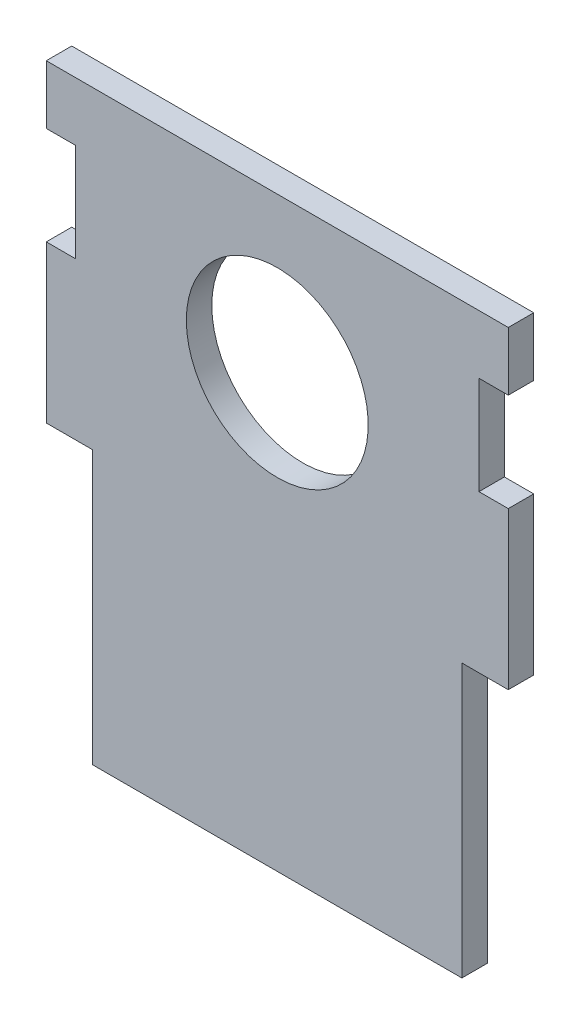
ISO-10303-21;
HEADER;
FILE_DESCRIPTION(('STEP AP214'),'2;1');
FILE_NAME('part.step','',(''),(''),'','','');
FILE_SCHEMA(('AUTOMOTIVE_DESIGN { 1 0 10303 214 1 1 1 1 }'));
ENDSEC;
DATA;
#1=APPLICATION_CONTEXT('core data for automotive mechanical design processes');
#2=APPLICATION_PROTOCOL_DEFINITION('international standard','automotive_design',2000,#1);
#3=PRODUCT_CONTEXT('',#1,'mechanical');
#4=PRODUCT('Part','Part','',(#3));
#5=PRODUCT_RELATED_PRODUCT_CATEGORY('part','',(#4));
#6=PRODUCT_DEFINITION_FORMATION('','',#4);
#7=PRODUCT_DEFINITION_CONTEXT('part definition',#1,'design');
#8=PRODUCT_DEFINITION('design','',#6,#7);
#9=PRODUCT_DEFINITION_SHAPE('','',#8);
#10=(LENGTH_UNIT() NAMED_UNIT(*) SI_UNIT(.MILLI.,.METRE.));
#11=(NAMED_UNIT(*) PLANE_ANGLE_UNIT() SI_UNIT($,.RADIAN.));
#12=(NAMED_UNIT(*) SI_UNIT($,.STERADIAN.) SOLID_ANGLE_UNIT());
#13=UNCERTAINTY_MEASURE_WITH_UNIT(LENGTH_MEASURE(1.E-05),#10,'distance_accuracy_value','');
#14=(GEOMETRIC_REPRESENTATION_CONTEXT(3) GLOBAL_UNCERTAINTY_ASSIGNED_CONTEXT((#13)) GLOBAL_UNIT_ASSIGNED_CONTEXT((#10,
#11,#12)) REPRESENTATION_CONTEXT('',''));
#15=CARTESIAN_POINT('',(0.,0.,0.));
#16=DIRECTION('',(0.,0.,1.));
#17=DIRECTION('',(1.,0.,0.));
#18=AXIS2_PLACEMENT_3D('',#15,#16,#17);
#19=CARTESIAN_POINT('',(0.,0.45,0.));
#20=DIRECTION('',(0.,0.,1.));
#21=DIRECTION('',(1.,0.,0.));
#22=AXIS2_PLACEMENT_3D('',#19,#20,#21);
#23=PLANE('',#22);
#24=CARTESIAN_POINT('',(0.,3.5,0.));
#25=DIRECTION('',(0.,0.,-1.));
#26=DIRECTION('',(1.,0.,0.));
#27=AXIS2_PLACEMENT_3D('',#24,#25,#26);
#28=CIRCLE('',#27,2.);
#29=CARTESIAN_POINT('',(-2.,3.5,0.));
#30=VERTEX_POINT('',#29);
#31=EDGE_CURVE('E291',#30,#30,#28,.T.);
#32=ORIENTED_EDGE('',*,*,#31,.T.);
#33=EDGE_LOOP('',(#32));
#34=FACE_BOUND('',#33,.T.);
#35=DIRECTION('',(1.,0.,0.));
#36=VECTOR('',#35,1.);
#37=CARTESIAN_POINT('',(3.2578341766688,5.60965004635288,0.));
#38=LINE('',#37,#36);
#39=CARTESIAN_POINT('',(4.43518107104955,5.60965004635288,0.));
#40=VERTEX_POINT('',#39);
#41=CARTESIAN_POINT('',(5.08,5.60965004635288,0.));
#42=VERTEX_POINT('',#41);
#43=EDGE_CURVE('E265',#40,#42,#38,.T.);
#44=ORIENTED_EDGE('',*,*,#43,.T.);
#45=DIRECTION('',(0.,1.,0.));
#46=VECTOR('',#45,1.);
#47=CARTESIAN_POINT('',(5.08,0.,0.));
#48=LINE('',#47,#46);
#49=CARTESIAN_POINT('',(5.08,6.9,0.));
#50=VERTEX_POINT('',#49);
#51=EDGE_CURVE('E274',#42,#50,#48,.T.);
#52=ORIENTED_EDGE('',*,*,#51,.T.);
#53=DIRECTION('',(-1.,0.,0.));
#54=VECTOR('',#53,1.);
#55=CARTESIAN_POINT('',(4.06,6.9,0.));
#56=LINE('',#55,#54);
#57=CARTESIAN_POINT('',(-5.08,6.9,0.));
#58=VERTEX_POINT('',#57);
#59=EDGE_CURVE('E11',#50,#58,#56,.T.);
#60=ORIENTED_EDGE('',*,*,#59,.T.);
#61=DIRECTION('',(0.,-1.,0.));
#62=VECTOR('',#61,1.);
#63=CARTESIAN_POINT('',(-5.08,6.9,0.));
#64=LINE('',#63,#62);
#65=CARTESIAN_POINT('',(-5.08,5.60965004635288,0.));
#66=VERTEX_POINT('',#65);
#67=EDGE_CURVE('E194',#58,#66,#64,.T.);
#68=ORIENTED_EDGE('',*,*,#67,.T.);
#69=DIRECTION('',(1.,0.,0.));
#70=VECTOR('',#69,1.);
#71=CARTESIAN_POINT('',(-2.21759053552478,5.60965004635288,0.));
#72=LINE('',#71,#70);
#73=CARTESIAN_POINT('',(-4.43518107104955,5.60965004635288,0.));
#74=VERTEX_POINT('',#73);
#75=EDGE_CURVE('E198',#66,#74,#72,.T.);
#76=ORIENTED_EDGE('',*,*,#75,.T.);
#77=DIRECTION('',(0.,-1.,0.));
#78=VECTOR('',#77,1.);
#79=CARTESIAN_POINT('',(-4.43518107104955,1.95,0.));
#80=LINE('',#79,#78);
#81=CARTESIAN_POINT('',(-4.43518107104955,3.45,0.));
#82=VERTEX_POINT('',#81);
#83=EDGE_CURVE('E239',#74,#82,#80,.T.);
#84=ORIENTED_EDGE('',*,*,#83,.T.);
#85=DIRECTION('',(-1.,0.,0.));
#86=VECTOR('',#85,1.);
#87=CARTESIAN_POINT('',(-3.2578341766688,3.45,0.));
#88=LINE('',#87,#86);
#89=CARTESIAN_POINT('',(-5.08,3.45,0.));
#90=VERTEX_POINT('',#89);
#91=EDGE_CURVE('E244',#82,#90,#88,.T.);
#92=ORIENTED_EDGE('',*,*,#91,.T.);
#93=DIRECTION('',(0.,-1.,0.));
#94=VECTOR('',#93,1.);
#95=CARTESIAN_POINT('',(-5.08,6.9,0.));
#96=LINE('',#95,#94);
#97=CARTESIAN_POINT('',(-5.08,0.,0.));
#98=VERTEX_POINT('',#97);
#99=EDGE_CURVE('E93',#90,#98,#96,.T.);
#100=ORIENTED_EDGE('',*,*,#99,.T.);
#101=DIRECTION('',(1.,0.,0.));
#102=VECTOR('',#101,1.);
#103=CARTESIAN_POINT('',(-5.08,0.,0.));
#104=LINE('',#103,#102);
#105=CARTESIAN_POINT('',(-4.06,0.,0.));
#106=VERTEX_POINT('',#105);
#107=EDGE_CURVE('E260',#98,#106,#104,.T.);
#108=ORIENTED_EDGE('',*,*,#107,.T.);
#109=DIRECTION('',(0.,-1.,0.));
#110=VECTOR('',#109,1.);
#111=CARTESIAN_POINT('',(-4.06,6.9,0.));
#112=LINE('',#111,#110);
#113=CARTESIAN_POINT('',(-4.06,-6.,0.));
#114=VERTEX_POINT('',#113);
#115=EDGE_CURVE('E236',#106,#114,#112,.T.);
#116=ORIENTED_EDGE('',*,*,#115,.T.);
#117=DIRECTION('',(1.,0.,0.));
#118=VECTOR('',#117,1.);
#119=CARTESIAN_POINT('',(-4.06,-6.,0.));
#120=LINE('',#119,#118);
#121=CARTESIAN_POINT('',(4.06,-6.,0.));
#122=VERTEX_POINT('',#121);
#123=EDGE_CURVE('E27',#114,#122,#120,.T.);
#124=ORIENTED_EDGE('',*,*,#123,.T.);
#125=DIRECTION('',(0.,1.,0.));
#126=VECTOR('',#125,1.);
#127=CARTESIAN_POINT('',(4.06,-6.,0.));
#128=LINE('',#127,#126);
#129=CARTESIAN_POINT('',(4.06,0.,0.));
#130=VERTEX_POINT('',#129);
#131=EDGE_CURVE('E269',#122,#130,#128,.T.);
#132=ORIENTED_EDGE('',*,*,#131,.T.);
#133=DIRECTION('',(1.,0.,0.));
#134=VECTOR('',#133,1.);
#135=CARTESIAN_POINT('',(-5.08,0.,0.));
#136=LINE('',#135,#134);
#137=CARTESIAN_POINT('',(5.08,0.,0.));
#138=VERTEX_POINT('',#137);
#139=EDGE_CURVE('E232',#130,#138,#136,.T.);
#140=ORIENTED_EDGE('',*,*,#139,.T.);
#141=DIRECTION('',(0.,1.,0.));
#142=VECTOR('',#141,1.);
#143=CARTESIAN_POINT('',(5.08,0.,0.));
#144=LINE('',#143,#142);
#145=CARTESIAN_POINT('',(5.08,3.45,0.));
#146=VERTEX_POINT('',#145);
#147=EDGE_CURVE('E303',#138,#146,#144,.T.);
#148=ORIENTED_EDGE('',*,*,#147,.T.);
#149=DIRECTION('',(-1.,0.,0.));
#150=VECTOR('',#149,1.);
#151=CARTESIAN_POINT('',(2.21759053552478,3.45,0.));
#152=LINE('',#151,#150);
#153=CARTESIAN_POINT('',(4.43518107104955,3.45,0.));
#154=VERTEX_POINT('',#153);
#155=EDGE_CURVE('E285',#146,#154,#152,.T.);
#156=ORIENTED_EDGE('',*,*,#155,.T.);
#157=DIRECTION('',(0.,1.,0.));
#158=VECTOR('',#157,1.);
#159=CARTESIAN_POINT('',(4.43518107104955,3.02982502317644,0.));
#160=LINE('',#159,#158);
#161=EDGE_CURVE('E227',#154,#40,#160,.T.);
#162=ORIENTED_EDGE('',*,*,#161,.T.);
#163=EDGE_LOOP('',(#44,#52,#60,#68,#76,#84,#92,#100,#108,#116,#124,#132,#140,#148,#156,#162));
#164=FACE_BOUND('',#163,.T.);
#165=ADVANCED_FACE('F16',(#34,#164),#23,.T.);
#166=CARTESIAN_POINT('',(-4.06,6.9,0.));
#167=DIRECTION('',(0.,1.,0.));
#168=DIRECTION('',(1.,0.,0.));
#169=AXIS2_PLACEMENT_3D('',#166,#167,#168);
#170=PLANE('',#169);
#171=ORIENTED_EDGE('',*,*,#59,.F.);
#172=DIRECTION('',(0.,0.,-1.));
#173=VECTOR('',#172,1.);
#174=CARTESIAN_POINT('',(5.08,6.9,0.));
#175=LINE('',#174,#173);
#176=CARTESIAN_POINT('',(5.08,6.9,-0.56));
#177=VERTEX_POINT('',#176);
#178=EDGE_CURVE('E278',#50,#177,#175,.T.);
#179=ORIENTED_EDGE('',*,*,#178,.T.);
#180=DIRECTION('',(1.,0.,0.));
#181=VECTOR('',#180,1.);
#182=CARTESIAN_POINT('',(5.08,6.9,-0.56));
#183=LINE('',#182,#181);
#184=CARTESIAN_POINT('',(-5.08,6.9,-0.56));
#185=VERTEX_POINT('',#184);
#186=EDGE_CURVE('E256',#185,#177,#183,.T.);
#187=ORIENTED_EDGE('',*,*,#186,.F.);
#188=DIRECTION('',(0.,0.,-1.));
#189=VECTOR('',#188,1.);
#190=CARTESIAN_POINT('',(-5.08,6.9,0.));
#191=LINE('',#190,#189);
#192=EDGE_CURVE('E149',#58,#185,#191,.T.);
#193=ORIENTED_EDGE('',*,*,#192,.F.);
#194=EDGE_LOOP('',(#171,#179,#187,#193));
#195=FACE_BOUND('',#194,.T.);
#196=ADVANCED_FACE('F547',(#195),#170,.T.);
#197=CARTESIAN_POINT('',(4.06,-6.,0.));
#198=DIRECTION('',(0.,-1.,0.));
#199=DIRECTION('',(0.,0.,-1.));
#200=AXIS2_PLACEMENT_3D('',#197,#198,#199);
#201=PLANE('',#200);
#202=ORIENTED_EDGE('',*,*,#123,.F.);
#203=DIRECTION('',(0.,0.,-1.));
#204=VECTOR('',#203,1.);
#205=CARTESIAN_POINT('',(-4.06,-6.,0.));
#206=LINE('',#205,#204);
#207=CARTESIAN_POINT('',(-4.06,-6.,-0.56));
#208=VERTEX_POINT('',#207);
#209=EDGE_CURVE('E226',#114,#208,#206,.T.);
#210=ORIENTED_EDGE('',*,*,#209,.T.);
#211=DIRECTION('',(-1.,0.,0.));
#212=VECTOR('',#211,1.);
#213=CARTESIAN_POINT('',(-4.06,-6.,-0.56));
#214=LINE('',#213,#212);
#215=CARTESIAN_POINT('',(4.06,-6.,-0.56));
#216=VERTEX_POINT('',#215);
#217=EDGE_CURVE('E279',#216,#208,#214,.T.);
#218=ORIENTED_EDGE('',*,*,#217,.F.);
#219=DIRECTION('',(0.,0.,-1.));
#220=VECTOR('',#219,1.);
#221=CARTESIAN_POINT('',(4.06,-6.,0.));
#222=LINE('',#221,#220);
#223=EDGE_CURVE('E306',#122,#216,#222,.T.);
#224=ORIENTED_EDGE('',*,*,#223,.F.);
#225=EDGE_LOOP('',(#202,#210,#218,#224));
#226=FACE_BOUND('',#225,.T.);
#227=ADVANCED_FACE('F552',(#226),#201,.T.);
#228=CARTESIAN_POINT('',(4.06,6.9,0.));
#229=DIRECTION('',(1.,0.,0.));
#230=DIRECTION('',(0.,1.,0.));
#231=AXIS2_PLACEMENT_3D('',#228,#229,#230);
#232=PLANE('',#231);
#233=DIRECTION('',(0.,0.,1.));
#234=VECTOR('',#233,1.);
#235=CARTESIAN_POINT('',(4.06,0.,0.));
#236=LINE('',#235,#234);
#237=CARTESIAN_POINT('',(4.06,0.,-0.56));
#238=VERTEX_POINT('',#237);
#239=EDGE_CURVE('E235',#238,#130,#236,.T.);
#240=ORIENTED_EDGE('',*,*,#239,.T.);
#241=ORIENTED_EDGE('',*,*,#131,.F.);
#242=ORIENTED_EDGE('',*,*,#223,.T.);
#243=DIRECTION('',(0.,-1.,0.));
#244=VECTOR('',#243,1.);
#245=CARTESIAN_POINT('',(4.06,-6.,-0.56));
#246=LINE('',#245,#244);
#247=EDGE_CURVE('E284',#238,#216,#246,.T.);
#248=ORIENTED_EDGE('',*,*,#247,.F.);
#249=EDGE_LOOP('',(#240,#241,#242,#248));
#250=FACE_BOUND('',#249,.T.);
#251=ADVANCED_FACE('F601',(#250),#232,.T.);
#252=CARTESIAN_POINT('',(5.08,0.,0.));
#253=DIRECTION('',(0.,-1.,0.));
#254=DIRECTION('',(0.,0.,-1.));
#255=AXIS2_PLACEMENT_3D('',#252,#253,#254);
#256=PLANE('',#255);
#257=ORIENTED_EDGE('',*,*,#139,.F.);
#258=ORIENTED_EDGE('',*,*,#239,.F.);
#259=DIRECTION('',(-1.,0.,0.));
#260=VECTOR('',#259,1.);
#261=CARTESIAN_POINT('',(-5.08,0.,-0.56));
#262=LINE('',#261,#260);
#263=CARTESIAN_POINT('',(5.08,0.,-0.56));
#264=VERTEX_POINT('',#263);
#265=EDGE_CURVE('E277',#264,#238,#262,.T.);
#266=ORIENTED_EDGE('',*,*,#265,.F.);
#267=DIRECTION('',(0.,0.,-1.));
#268=VECTOR('',#267,1.);
#269=CARTESIAN_POINT('',(5.08,0.,0.));
#270=LINE('',#269,#268);
#271=EDGE_CURVE('E298',#138,#264,#270,.T.);
#272=ORIENTED_EDGE('',*,*,#271,.F.);
#273=EDGE_LOOP('',(#257,#258,#266,#272));
#274=FACE_BOUND('',#273,.T.);
#275=ADVANCED_FACE('F542',(#274),#256,.T.);
#276=CARTESIAN_POINT('',(-4.06,-6.,0.));
#277=DIRECTION('',(-1.,0.,0.));
#278=DIRECTION('',(0.,0.,1.));
#279=AXIS2_PLACEMENT_3D('',#276,#277,#278);
#280=PLANE('',#279);
#281=DIRECTION('',(0.,0.,-1.));
#282=VECTOR('',#281,1.);
#283=CARTESIAN_POINT('',(-4.06,0.,0.));
#284=LINE('',#283,#282);
#285=CARTESIAN_POINT('',(-4.06,0.,-0.56));
#286=VERTEX_POINT('',#285);
#287=EDGE_CURVE('E257',#106,#286,#284,.T.);
#288=ORIENTED_EDGE('',*,*,#287,.T.);
#289=DIRECTION('',(0.,1.,0.));
#290=VECTOR('',#289,1.);
#291=CARTESIAN_POINT('',(-4.06,6.9,-0.56));
#292=LINE('',#291,#290);
#293=EDGE_CURVE('E283',#208,#286,#292,.T.);
#294=ORIENTED_EDGE('',*,*,#293,.F.);
#295=ORIENTED_EDGE('',*,*,#209,.F.);
#296=ORIENTED_EDGE('',*,*,#115,.F.);
#297=EDGE_LOOP('',(#288,#294,#295,#296));
#298=FACE_BOUND('',#297,.T.);
#299=ADVANCED_FACE('F378',(#298),#280,.T.);
#300=CARTESIAN_POINT('',(-4.06,0.,0.));
#301=DIRECTION('',(0.,-1.,0.));
#302=DIRECTION('',(0.,0.,-1.));
#303=AXIS2_PLACEMENT_3D('',#300,#301,#302);
#304=PLANE('',#303);
#305=ORIENTED_EDGE('',*,*,#107,.F.);
#306=DIRECTION('',(0.,0.,-1.));
#307=VECTOR('',#306,1.);
#308=CARTESIAN_POINT('',(-5.08,0.,0.));
#309=LINE('',#308,#307);
#310=CARTESIAN_POINT('',(-5.08,0.,-0.56));
#311=VERTEX_POINT('',#310);
#312=EDGE_CURVE('E159',#98,#311,#309,.T.);
#313=ORIENTED_EDGE('',*,*,#312,.T.);
#314=DIRECTION('',(-1.,0.,0.));
#315=VECTOR('',#314,1.);
#316=CARTESIAN_POINT('',(-5.08,0.,-0.56));
#317=LINE('',#316,#315);
#318=EDGE_CURVE('E318',#286,#311,#317,.T.);
#319=ORIENTED_EDGE('',*,*,#318,.F.);
#320=ORIENTED_EDGE('',*,*,#287,.F.);
#321=EDGE_LOOP('',(#305,#313,#319,#320));
#322=FACE_BOUND('',#321,.T.);
#323=ADVANCED_FACE('F375',(#322),#304,.T.);
#324=CARTESIAN_POINT('',(0.,3.5,0.));
#325=DIRECTION('',(0.,0.,1.));
#326=DIRECTION('',(1.,0.,0.));
#327=AXIS2_PLACEMENT_3D('',#324,#325,#326);
#328=CYLINDRICAL_SURFACE('',#327,2.);
#329=CARTESIAN_POINT('',(0.,3.5,-0.56));
#330=DIRECTION('',(0.,0.,1.));
#331=DIRECTION('',(1.,0.,0.));
#332=AXIS2_PLACEMENT_3D('',#329,#330,#331);
#333=CIRCLE('',#332,2.);
#334=CARTESIAN_POINT('',(-2.,3.5,-0.56));
#335=VERTEX_POINT('',#334);
#336=EDGE_CURVE('E202',#335,#335,#333,.T.);
#337=ORIENTED_EDGE('',*,*,#336,.F.);
#338=DIRECTION('',(0.,0.,1.));
#339=VECTOR('',#338,1.);
#340=CARTESIAN_POINT('',(-2.,3.5,0.));
#341=LINE('',#340,#339);
#342=EDGE_CURVE('E295',#335,#30,#341,.T.);
#343=ORIENTED_EDGE('',*,*,#342,.T.);
#344=ORIENTED_EDGE('',*,*,#31,.F.);
#345=ORIENTED_EDGE('',*,*,#342,.F.);
#346=EDGE_LOOP('',(#337,#343,#344,#345));
#347=FACE_BOUND('',#346,.T.);
#348=ADVANCED_FACE('F518',(#347),#328,.F.);
#349=CARTESIAN_POINT('',(-5.08,0.,0.));
#350=DIRECTION('',(-1.,0.,0.));
#351=DIRECTION('',(0.,0.,1.));
#352=AXIS2_PLACEMENT_3D('',#349,#350,#351);
#353=PLANE('',#352);
#354=DIRECTION('',(0.,0.,-1.));
#355=VECTOR('',#354,1.);
#356=CARTESIAN_POINT('',(-5.08,3.45,-0.28));
#357=LINE('',#356,#355);
#358=CARTESIAN_POINT('',(-5.08,3.45,-0.56));
#359=VERTEX_POINT('',#358);
#360=EDGE_CURVE('E253',#90,#359,#357,.T.);
#361=ORIENTED_EDGE('',*,*,#360,.T.);
#362=DIRECTION('',(0.,1.,0.));
#363=VECTOR('',#362,1.);
#364=CARTESIAN_POINT('',(-5.08,6.9,-0.56));
#365=LINE('',#364,#363);
#366=EDGE_CURVE('E114',#311,#359,#365,.T.);
#367=ORIENTED_EDGE('',*,*,#366,.F.);
#368=ORIENTED_EDGE('',*,*,#312,.F.);
#369=ORIENTED_EDGE('',*,*,#99,.F.);
#370=EDGE_LOOP('',(#361,#367,#368,#369));
#371=FACE_BOUND('',#370,.T.);
#372=ADVANCED_FACE('F513',(#371),#353,.T.);
#373=CARTESIAN_POINT('',(-5.08,0.,0.));
#374=DIRECTION('',(-1.,0.,0.));
#375=DIRECTION('',(0.,0.,1.));
#376=AXIS2_PLACEMENT_3D('',#373,#374,#375);
#377=PLANE('',#376);
#378=DIRECTION('',(0.,0.,1.));
#379=VECTOR('',#378,1.);
#380=CARTESIAN_POINT('',(-5.08,5.60965004635288,-0.28));
#381=LINE('',#380,#379);
#382=CARTESIAN_POINT('',(-5.08,5.60965004635288,-0.56));
#383=VERTEX_POINT('',#382);
#384=EDGE_CURVE('E205',#383,#66,#381,.T.);
#385=ORIENTED_EDGE('',*,*,#384,.T.);
#386=ORIENTED_EDGE('',*,*,#67,.F.);
#387=ORIENTED_EDGE('',*,*,#192,.T.);
#388=DIRECTION('',(0.,1.,0.));
#389=VECTOR('',#388,1.);
#390=CARTESIAN_POINT('',(-5.08,6.9,-0.56));
#391=LINE('',#390,#389);
#392=EDGE_CURVE('E208',#383,#185,#391,.T.);
#393=ORIENTED_EDGE('',*,*,#392,.F.);
#394=EDGE_LOOP('',(#385,#386,#387,#393));
#395=FACE_BOUND('',#394,.T.);
#396=ADVANCED_FACE('F206',(#395),#377,.T.);
#397=CARTESIAN_POINT('',(0.,0.45,-0.56));
#398=DIRECTION('',(0.,0.,-1.));
#399=DIRECTION('',(0.,-1.,0.));
#400=AXIS2_PLACEMENT_3D('',#397,#398,#399);
#401=PLANE('',#400);
#402=ORIENTED_EDGE('',*,*,#336,.T.);
#403=EDGE_LOOP('',(#402));
#404=FACE_BOUND('',#403,.T.);
#405=DIRECTION('',(-1.,0.,0.));
#406=VECTOR('',#405,1.);
#407=CARTESIAN_POINT('',(3.2578341766688,5.60965004635288,-0.56));
#408=LINE('',#407,#406);
#409=CARTESIAN_POINT('',(5.08,5.60965004635288,-0.56));
#410=VERTEX_POINT('',#409);
#411=CARTESIAN_POINT('',(4.43518107104955,5.60965004635288,-0.56));
#412=VERTEX_POINT('',#411);
#413=EDGE_CURVE('E243',#410,#412,#408,.T.);
#414=ORIENTED_EDGE('',*,*,#413,.T.);
#415=DIRECTION('',(0.,-1.,0.));
#416=VECTOR('',#415,1.);
#417=CARTESIAN_POINT('',(4.43518107104955,3.02982502317644,-0.56));
#418=LINE('',#417,#416);
#419=CARTESIAN_POINT('',(4.43518107104955,3.45,-0.56));
#420=VERTEX_POINT('',#419);
#421=EDGE_CURVE('E273',#412,#420,#418,.T.);
#422=ORIENTED_EDGE('',*,*,#421,.T.);
#423=DIRECTION('',(1.,0.,0.));
#424=VECTOR('',#423,1.);
#425=CARTESIAN_POINT('',(2.21759053552478,3.45,-0.56));
#426=LINE('',#425,#424);
#427=CARTESIAN_POINT('',(5.08,3.45,-0.56));
#428=VERTEX_POINT('',#427);
#429=EDGE_CURVE('E249',#420,#428,#426,.T.);
#430=ORIENTED_EDGE('',*,*,#429,.T.);
#431=DIRECTION('',(0.,-1.,0.));
#432=VECTOR('',#431,1.);
#433=CARTESIAN_POINT('',(5.08,0.,-0.56));
#434=LINE('',#433,#432);
#435=EDGE_CURVE('E302',#428,#264,#434,.T.);
#436=ORIENTED_EDGE('',*,*,#435,.T.);
#437=ORIENTED_EDGE('',*,*,#265,.T.);
#438=ORIENTED_EDGE('',*,*,#247,.T.);
#439=ORIENTED_EDGE('',*,*,#217,.T.);
#440=ORIENTED_EDGE('',*,*,#293,.T.);
#441=ORIENTED_EDGE('',*,*,#318,.T.);
#442=ORIENTED_EDGE('',*,*,#366,.T.);
#443=DIRECTION('',(1.,0.,0.));
#444=VECTOR('',#443,1.);
#445=CARTESIAN_POINT('',(-3.2578341766688,3.45,-0.56));
#446=LINE('',#445,#444);
#447=CARTESIAN_POINT('',(-4.43518107104955,3.45,-0.56));
#448=VERTEX_POINT('',#447);
#449=EDGE_CURVE('E250',#359,#448,#446,.T.);
#450=ORIENTED_EDGE('',*,*,#449,.T.);
#451=DIRECTION('',(0.,1.,0.));
#452=VECTOR('',#451,1.);
#453=CARTESIAN_POINT('',(-4.43518107104955,1.95,-0.56));
#454=LINE('',#453,#452);
#455=CARTESIAN_POINT('',(-4.43518107104955,5.60965004635288,-0.56));
#456=VERTEX_POINT('',#455);
#457=EDGE_CURVE('E103',#448,#456,#454,.T.);
#458=ORIENTED_EDGE('',*,*,#457,.T.);
#459=DIRECTION('',(-1.,0.,0.));
#460=VECTOR('',#459,1.);
#461=CARTESIAN_POINT('',(-2.21759053552478,5.60965004635288,-0.56));
#462=LINE('',#461,#460);
#463=EDGE_CURVE('E212',#456,#383,#462,.T.);
#464=ORIENTED_EDGE('',*,*,#463,.T.);
#465=ORIENTED_EDGE('',*,*,#392,.T.);
#466=ORIENTED_EDGE('',*,*,#186,.T.);
#467=DIRECTION('',(0.,-1.,0.));
#468=VECTOR('',#467,1.);
#469=CARTESIAN_POINT('',(5.08,0.,-0.56));
#470=LINE('',#469,#468);
#471=EDGE_CURVE('E343',#177,#410,#470,.T.);
#472=ORIENTED_EDGE('',*,*,#471,.T.);
#473=EDGE_LOOP('',(#414,#422,#430,#436,#437,#438,#439,#440,#441,#442,#450,#458,#464,#465,#466,#472));
#474=FACE_BOUND('',#473,.T.);
#475=ADVANCED_FACE('F562',(#404,#474),#401,.T.);
#476=CARTESIAN_POINT('',(5.08,6.9,0.));
#477=DIRECTION('',(1.,0.,0.));
#478=DIRECTION('',(0.,1.,0.));
#479=AXIS2_PLACEMENT_3D('',#476,#477,#478);
#480=PLANE('',#479);
#481=DIRECTION('',(0.,0.,-1.));
#482=VECTOR('',#481,1.);
#483=CARTESIAN_POINT('',(5.08,5.60965004635288,-0.28));
#484=LINE('',#483,#482);
#485=EDGE_CURVE('E231',#42,#410,#484,.T.);
#486=ORIENTED_EDGE('',*,*,#485,.T.);
#487=ORIENTED_EDGE('',*,*,#471,.F.);
#488=ORIENTED_EDGE('',*,*,#178,.F.);
#489=ORIENTED_EDGE('',*,*,#51,.F.);
#490=EDGE_LOOP('',(#486,#487,#488,#489));
#491=FACE_BOUND('',#490,.T.);
#492=ADVANCED_FACE('F18',(#491),#480,.T.);
#493=CARTESIAN_POINT('',(5.08,6.9,0.));
#494=DIRECTION('',(1.,0.,0.));
#495=DIRECTION('',(0.,1.,0.));
#496=AXIS2_PLACEMENT_3D('',#493,#494,#495);
#497=PLANE('',#496);
#498=DIRECTION('',(0.,0.,1.));
#499=VECTOR('',#498,1.);
#500=CARTESIAN_POINT('',(5.08,3.45,-0.28));
#501=LINE('',#500,#499);
#502=EDGE_CURVE('E20',#428,#146,#501,.T.);
#503=ORIENTED_EDGE('',*,*,#502,.T.);
#504=ORIENTED_EDGE('',*,*,#147,.F.);
#505=ORIENTED_EDGE('',*,*,#271,.T.);
#506=ORIENTED_EDGE('',*,*,#435,.F.);
#507=EDGE_LOOP('',(#503,#504,#505,#506));
#508=FACE_BOUND('',#507,.T.);
#509=ADVANCED_FACE('F508',(#508),#497,.T.);
#510=CARTESIAN_POINT('',(-4.43518107104955,5.60965004635288,-0.56));
#511=DIRECTION('',(0.,1.,0.));
#512=DIRECTION('',(1.,0.,0.));
#513=AXIS2_PLACEMENT_3D('',#510,#511,#512);
#514=PLANE('',#513);
#515=ORIENTED_EDGE('',*,*,#75,.F.);
#516=ORIENTED_EDGE('',*,*,#384,.F.);
#517=ORIENTED_EDGE('',*,*,#463,.F.);
#518=DIRECTION('',(0.,0.,1.));
#519=VECTOR('',#518,1.);
#520=CARTESIAN_POINT('',(-4.43518107104955,5.60965004635288,-0.56));
#521=LINE('',#520,#519);
#522=EDGE_CURVE('E215',#456,#74,#521,.T.);
#523=ORIENTED_EDGE('',*,*,#522,.T.);
#524=EDGE_LOOP('',(#515,#516,#517,#523));
#525=FACE_BOUND('',#524,.T.);
#526=ADVANCED_FACE('F214',(#525),#514,.F.);
#527=CARTESIAN_POINT('',(-4.43518107104955,3.45,-0.56));
#528=DIRECTION('',(1.,0.,0.));
#529=DIRECTION('',(0.,-1.,0.));
#530=AXIS2_PLACEMENT_3D('',#527,#528,#529);
#531=PLANE('',#530);
#532=ORIENTED_EDGE('',*,*,#83,.F.);
#533=ORIENTED_EDGE('',*,*,#522,.F.);
#534=ORIENTED_EDGE('',*,*,#457,.F.);
#535=DIRECTION('',(0.,0.,1.));
#536=VECTOR('',#535,1.);
#537=CARTESIAN_POINT('',(-4.43518107104955,3.45,-0.56));
#538=LINE('',#537,#536);
#539=EDGE_CURVE('E248',#448,#82,#538,.T.);
#540=ORIENTED_EDGE('',*,*,#539,.T.);
#541=EDGE_LOOP('',(#532,#533,#534,#540));
#542=FACE_BOUND('',#541,.T.);
#543=ADVANCED_FACE('F494',(#542),#531,.F.);
#544=CARTESIAN_POINT('',(-6.5156683533376,3.45,-0.56));
#545=DIRECTION('',(0.,-1.,0.));
#546=DIRECTION('',(0.,0.,-1.));
#547=AXIS2_PLACEMENT_3D('',#544,#545,#546);
#548=PLANE('',#547);
#549=ORIENTED_EDGE('',*,*,#91,.F.);
#550=ORIENTED_EDGE('',*,*,#539,.F.);
#551=ORIENTED_EDGE('',*,*,#449,.F.);
#552=ORIENTED_EDGE('',*,*,#360,.F.);
#553=EDGE_LOOP('',(#549,#550,#551,#552));
#554=FACE_BOUND('',#553,.T.);
#555=ADVANCED_FACE('F499',(#554),#548,.F.);
#556=CARTESIAN_POINT('',(4.43518107104955,3.45,-0.56));
#557=DIRECTION('',(0.,-1.,0.));
#558=DIRECTION('',(0.,0.,-1.));
#559=AXIS2_PLACEMENT_3D('',#556,#557,#558);
#560=PLANE('',#559);
#561=ORIENTED_EDGE('',*,*,#155,.F.);
#562=ORIENTED_EDGE('',*,*,#502,.F.);
#563=ORIENTED_EDGE('',*,*,#429,.F.);
#564=DIRECTION('',(0.,0.,1.));
#565=VECTOR('',#564,1.);
#566=CARTESIAN_POINT('',(4.43518107104955,3.45,-0.56));
#567=LINE('',#566,#565);
#568=EDGE_CURVE('E230',#420,#154,#567,.T.);
#569=ORIENTED_EDGE('',*,*,#568,.T.);
#570=EDGE_LOOP('',(#561,#562,#563,#569));
#571=FACE_BOUND('',#570,.T.);
#572=ADVANCED_FACE('F570',(#571),#560,.F.);
#573=CARTESIAN_POINT('',(4.43518107104955,5.60965004635288,-0.56));
#574=DIRECTION('',(-1.,0.,0.));
#575=DIRECTION('',(0.,0.,1.));
#576=AXIS2_PLACEMENT_3D('',#573,#574,#575);
#577=PLANE('',#576);
#578=ORIENTED_EDGE('',*,*,#161,.F.);
#579=ORIENTED_EDGE('',*,*,#568,.F.);
#580=ORIENTED_EDGE('',*,*,#421,.F.);
#581=DIRECTION('',(0.,0.,1.));
#582=VECTOR('',#581,1.);
#583=CARTESIAN_POINT('',(4.43518107104955,5.60965004635288,-0.56));
#584=LINE('',#583,#582);
#585=EDGE_CURVE('E261',#412,#40,#584,.T.);
#586=ORIENTED_EDGE('',*,*,#585,.T.);
#587=EDGE_LOOP('',(#578,#579,#580,#586));
#588=FACE_BOUND('',#587,.T.);
#589=ADVANCED_FACE('F591',(#588),#577,.F.);
#590=CARTESIAN_POINT('',(6.51566835333761,5.60965004635288,-0.56));
#591=DIRECTION('',(0.,1.,0.));
#592=DIRECTION('',(1.,0.,0.));
#593=AXIS2_PLACEMENT_3D('',#590,#591,#592);
#594=PLANE('',#593);
#595=ORIENTED_EDGE('',*,*,#43,.F.);
#596=ORIENTED_EDGE('',*,*,#585,.F.);
#597=ORIENTED_EDGE('',*,*,#413,.F.);
#598=ORIENTED_EDGE('',*,*,#485,.F.);
#599=EDGE_LOOP('',(#595,#596,#597,#598));
#600=FACE_BOUND('',#599,.T.);
#601=ADVANCED_FACE('F596',(#600),#594,.F.);
#602=CLOSED_SHELL('',(#165,#196,#227,#251,#275,#299,#323,#348,#372,#396,#475,#492,#509,#526,
#543,#555,#572,#589,#601));
#603=MANIFOLD_SOLID_BREP('B1',#602);
#604=ADVANCED_BREP_SHAPE_REPRESENTATION('',(#18,#603),#14);
#605=SHAPE_DEFINITION_REPRESENTATION(#9,#604);
ENDSEC;
END-ISO-10303-21;
